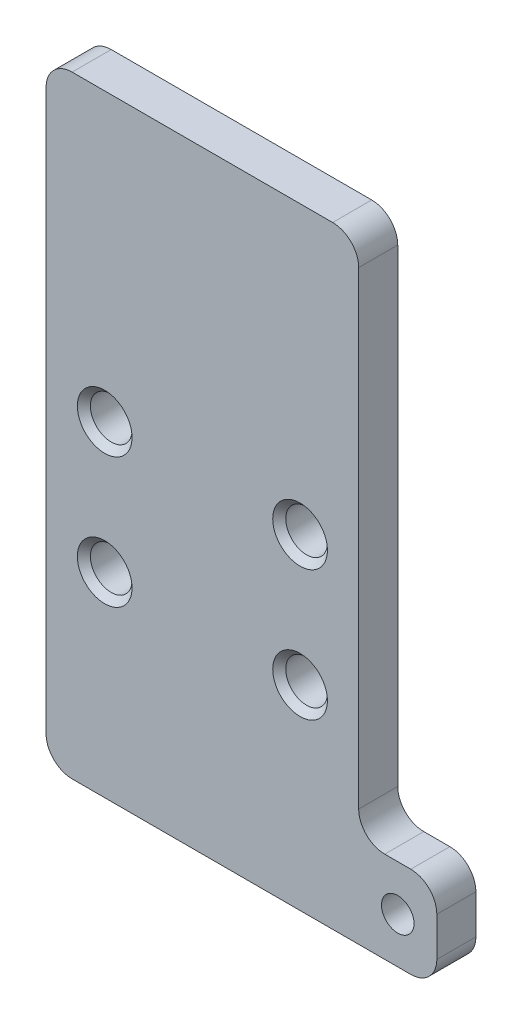
ISO-10303-21;
HEADER;
FILE_DESCRIPTION(('STEP AP214'),'2;1');
FILE_NAME('part.step','',(''),(''),'','','');
FILE_SCHEMA(('AUTOMOTIVE_DESIGN { 1 0 10303 214 1 1 1 1 }'));
ENDSEC;
DATA;
#1=APPLICATION_CONTEXT('core data for automotive mechanical design processes');
#2=APPLICATION_PROTOCOL_DEFINITION('international standard','automotive_design',2000,#1);
#3=PRODUCT_CONTEXT('',#1,'mechanical');
#4=PRODUCT('Part','Part','',(#3));
#5=PRODUCT_RELATED_PRODUCT_CATEGORY('part','',(#4));
#6=PRODUCT_DEFINITION_FORMATION('','',#4);
#7=PRODUCT_DEFINITION_CONTEXT('part definition',#1,'design');
#8=PRODUCT_DEFINITION('design','',#6,#7);
#9=PRODUCT_DEFINITION_SHAPE('','',#8);
#10=(LENGTH_UNIT() NAMED_UNIT(*) SI_UNIT(.MILLI.,.METRE.));
#11=(NAMED_UNIT(*) PLANE_ANGLE_UNIT() SI_UNIT($,.RADIAN.));
#12=(NAMED_UNIT(*) SI_UNIT($,.STERADIAN.) SOLID_ANGLE_UNIT());
#13=UNCERTAINTY_MEASURE_WITH_UNIT(LENGTH_MEASURE(1.E-05),#10,'distance_accuracy_value','');
#14=(GEOMETRIC_REPRESENTATION_CONTEXT(3) GLOBAL_UNCERTAINTY_ASSIGNED_CONTEXT((#13)) GLOBAL_UNIT_ASSIGNED_CONTEXT((#10,
#11,#12)) REPRESENTATION_CONTEXT('',''));
#15=CARTESIAN_POINT('',(0.,0.,0.));
#16=DIRECTION('',(0.,0.,1.));
#17=DIRECTION('',(1.,0.,0.));
#18=AXIS2_PLACEMENT_3D('',#15,#16,#17);
#19=CARTESIAN_POINT('',(0.,0.,3.));
#20=DIRECTION('',(0.,0.,-1.));
#21=DIRECTION('',(-1.,0.,0.));
#22=AXIS2_PLACEMENT_3D('',#19,#20,#21);
#23=PLANE('',#22);
#24=CARTESIAN_POINT('',(7.5,-17.,3.));
#25=DIRECTION('',(0.,0.,-1.));
#26=DIRECTION('',(-1.,0.,0.));
#27=AXIS2_PLACEMENT_3D('',#24,#25,#26);
#28=CIRCLE('',#27,2.1);
#29=CARTESIAN_POINT('',(5.4,-17.,3.));
#30=VERTEX_POINT('',#29);
#31=EDGE_CURVE('E202',#30,#30,#28,.T.);
#32=ORIENTED_EDGE('',*,*,#31,.T.);
#33=EDGE_LOOP('',(#32));
#34=FACE_BOUND('',#33,.T.);
#35=CARTESIAN_POINT('',(-7.5,-17.,3.));
#36=DIRECTION('',(0.,0.,-1.));
#37=DIRECTION('',(-1.,0.,0.));
#38=AXIS2_PLACEMENT_3D('',#35,#36,#37);
#39=CIRCLE('',#38,2.1);
#40=CARTESIAN_POINT('',(-9.6,-17.,3.));
#41=VERTEX_POINT('',#40);
#42=EDGE_CURVE('E199',#41,#41,#39,.T.);
#43=ORIENTED_EDGE('',*,*,#42,.T.);
#44=EDGE_LOOP('',(#43));
#45=FACE_BOUND('',#44,.T.);
#46=CARTESIAN_POINT('',(7.5,-7.,3.));
#47=DIRECTION('',(0.,0.,-1.));
#48=DIRECTION('',(-1.,0.,0.));
#49=AXIS2_PLACEMENT_3D('',#46,#47,#48);
#50=CIRCLE('',#49,2.1);
#51=CARTESIAN_POINT('',(5.4,-7.,3.));
#52=VERTEX_POINT('',#51);
#53=EDGE_CURVE('E195',#52,#52,#50,.T.);
#54=ORIENTED_EDGE('',*,*,#53,.T.);
#55=EDGE_LOOP('',(#54));
#56=FACE_BOUND('',#55,.T.);
#57=CARTESIAN_POINT('',(-7.5,-7.,3.));
#58=DIRECTION('',(0.,0.,-1.));
#59=DIRECTION('',(-1.,0.,0.));
#60=AXIS2_PLACEMENT_3D('',#57,#58,#59);
#61=CIRCLE('',#60,2.1);
#62=CARTESIAN_POINT('',(-9.6,-7.,3.));
#63=VERTEX_POINT('',#62);
#64=EDGE_CURVE('E191',#63,#63,#61,.T.);
#65=ORIENTED_EDGE('',*,*,#64,.T.);
#66=EDGE_LOOP('',(#65));
#67=FACE_BOUND('',#66,.T.);
#68=DIRECTION('',(0.,1.,0.));
#69=VECTOR('',#68,1.);
#70=CARTESIAN_POINT('',(12.,15.,3.));
#71=LINE('',#70,#69);
#72=CARTESIAN_POINT('',(12.,-23.,3.));
#73=VERTEX_POINT('',#72);
#74=CARTESIAN_POINT('',(12.,13.,3.));
#75=VERTEX_POINT('',#74);
#76=EDGE_CURVE('E291',#73,#75,#71,.T.);
#77=ORIENTED_EDGE('',*,*,#76,.T.);
#78=CARTESIAN_POINT('',(10.,13.,3.));
#79=DIRECTION('',(0.,0.,-1.));
#80=DIRECTION('',(-1.,0.,0.));
#81=AXIS2_PLACEMENT_3D('',#78,#79,#80);
#82=CIRCLE('',#81,2.);
#83=CARTESIAN_POINT('',(10.,15.,3.));
#84=VERTEX_POINT('',#83);
#85=EDGE_CURVE('E246',#75,#84,#82,.F.);
#86=ORIENTED_EDGE('',*,*,#85,.T.);
#87=DIRECTION('',(-1.,0.,0.));
#88=VECTOR('',#87,1.);
#89=CARTESIAN_POINT('',(-12.,15.,3.));
#90=LINE('',#89,#88);
#91=CARTESIAN_POINT('',(-10.,15.,3.));
#92=VERTEX_POINT('',#91);
#93=EDGE_CURVE('E156',#84,#92,#90,.T.);
#94=ORIENTED_EDGE('',*,*,#93,.T.);
#95=CARTESIAN_POINT('',(-10.,13.,3.));
#96=DIRECTION('',(0.,0.,-1.));
#97=DIRECTION('',(-1.,0.,0.));
#98=AXIS2_PLACEMENT_3D('',#95,#96,#97);
#99=CIRCLE('',#98,2.);
#100=CARTESIAN_POINT('',(-12.,13.,3.));
#101=VERTEX_POINT('',#100);
#102=EDGE_CURVE('E68',#92,#101,#99,.F.);
#103=ORIENTED_EDGE('',*,*,#102,.T.);
#104=DIRECTION('',(0.,-1.,0.));
#105=VECTOR('',#104,1.);
#106=CARTESIAN_POINT('',(-12.,15.,3.));
#107=LINE('',#106,#105);
#108=CARTESIAN_POINT('',(-12.,-30.,3.));
#109=VERTEX_POINT('',#108);
#110=EDGE_CURVE('E183',#101,#109,#107,.T.);
#111=ORIENTED_EDGE('',*,*,#110,.T.);
#112=CARTESIAN_POINT('',(-10.,-30.,3.));
#113=DIRECTION('',(0.,0.,-1.));
#114=DIRECTION('',(-1.,0.,0.));
#115=AXIS2_PLACEMENT_3D('',#112,#113,#114);
#116=CIRCLE('',#115,2.);
#117=CARTESIAN_POINT('',(-10.,-32.,3.));
#118=VERTEX_POINT('',#117);
#119=EDGE_CURVE('E241',#109,#118,#116,.F.);
#120=ORIENTED_EDGE('',*,*,#119,.T.);
#121=DIRECTION('',(1.,0.,0.));
#122=VECTOR('',#121,1.);
#123=CARTESIAN_POINT('',(-12.,-32.,3.));
#124=LINE('',#123,#122);
#125=CARTESIAN_POINT('',(16.,-32.,3.));
#126=VERTEX_POINT('',#125);
#127=EDGE_CURVE('E171',#118,#126,#124,.T.);
#128=ORIENTED_EDGE('',*,*,#127,.T.);
#129=CARTESIAN_POINT('',(16.,-30.,3.));
#130=DIRECTION('',(0.,0.,-1.));
#131=DIRECTION('',(-1.,0.,0.));
#132=AXIS2_PLACEMENT_3D('',#129,#130,#131);
#133=CIRCLE('',#132,2.);
#134=CARTESIAN_POINT('',(18.,-30.,3.));
#135=VERTEX_POINT('',#134);
#136=EDGE_CURVE('E238',#126,#135,#133,.F.);
#137=ORIENTED_EDGE('',*,*,#136,.T.);
#138=DIRECTION('',(0.,1.,0.));
#139=VECTOR('',#138,1.);
#140=CARTESIAN_POINT('',(18.,-25.,3.));
#141=LINE('',#140,#139);
#142=CARTESIAN_POINT('',(18.,-27.,3.));
#143=VERTEX_POINT('',#142);
#144=EDGE_CURVE('E300',#135,#143,#141,.T.);
#145=ORIENTED_EDGE('',*,*,#144,.T.);
#146=CARTESIAN_POINT('',(16.,-27.,3.));
#147=DIRECTION('',(0.,0.,-1.));
#148=DIRECTION('',(-1.,0.,0.));
#149=AXIS2_PLACEMENT_3D('',#146,#147,#148);
#150=CIRCLE('',#149,2.);
#151=CARTESIAN_POINT('',(16.,-25.,3.));
#152=VERTEX_POINT('',#151);
#153=EDGE_CURVE('E235',#143,#152,#150,.F.);
#154=ORIENTED_EDGE('',*,*,#153,.T.);
#155=DIRECTION('',(-1.,0.,0.));
#156=VECTOR('',#155,1.);
#157=CARTESIAN_POINT('',(12.,-25.,3.));
#158=LINE('',#157,#156);
#159=CARTESIAN_POINT('',(14.,-25.,3.));
#160=VERTEX_POINT('',#159);
#161=EDGE_CURVE('E292',#152,#160,#158,.T.);
#162=ORIENTED_EDGE('',*,*,#161,.T.);
#163=CARTESIAN_POINT('',(14.,-23.,3.));
#164=DIRECTION('',(0.,0.,-1.));
#165=DIRECTION('',(-1.,0.,0.));
#166=AXIS2_PLACEMENT_3D('',#163,#164,#165);
#167=CIRCLE('',#166,2.);
#168=EDGE_CURVE('E11',#160,#73,#167,.T.);
#169=ORIENTED_EDGE('',*,*,#168,.T.);
#170=EDGE_LOOP('',(#77,#86,#94,#103,#111,#120,#128,#137,#145,#154,#162,#169));
#171=FACE_BOUND('',#170,.T.);
#172=CARTESIAN_POINT('',(15.,-28.5,3.));
#173=DIRECTION('',(0.,0.,1.));
#174=DIRECTION('',(1.,0.,0.));
#175=AXIS2_PLACEMENT_3D('',#172,#173,#174);
#176=CIRCLE('',#175,1.25);
#177=CARTESIAN_POINT('',(16.25,-28.5,3.));
#178=VERTEX_POINT('',#177);
#179=EDGE_CURVE('E310',#178,#178,#176,.T.);
#180=ORIENTED_EDGE('',*,*,#179,.F.);
#181=EDGE_LOOP('',(#180));
#182=FACE_BOUND('',#181,.T.);
#183=ADVANCED_FACE('F45',(#34,#45,#56,#67,#171,#182),#23,.F.);
#184=CARTESIAN_POINT('',(0.,0.,0.));
#185=DIRECTION('',(0.,0.,-1.));
#186=DIRECTION('',(-1.,0.,0.));
#187=AXIS2_PLACEMENT_3D('',#184,#185,#186);
#188=PLANE('',#187);
#189=CARTESIAN_POINT('',(15.,-28.5,0.));
#190=DIRECTION('',(0.,0.,-1.));
#191=DIRECTION('',(-1.,0.,0.));
#192=AXIS2_PLACEMENT_3D('',#189,#190,#191);
#193=CIRCLE('',#192,1.74999999999999);
#194=CARTESIAN_POINT('',(13.25,-28.5,0.));
#195=VERTEX_POINT('',#194);
#196=EDGE_CURVE('E178',#195,#195,#193,.F.);
#197=ORIENTED_EDGE('',*,*,#196,.T.);
#198=EDGE_LOOP('',(#197));
#199=FACE_BOUND('',#198,.T.);
#200=CARTESIAN_POINT('',(-7.5,-17.,0.));
#201=DIRECTION('',(0.,0.,1.));
#202=DIRECTION('',(1.,0.,0.));
#203=AXIS2_PLACEMENT_3D('',#200,#201,#202);
#204=CIRCLE('',#203,1.6);
#205=CARTESIAN_POINT('',(-5.9,-17.,0.));
#206=VERTEX_POINT('',#205);
#207=EDGE_CURVE('E340',#206,#206,#204,.T.);
#208=ORIENTED_EDGE('',*,*,#207,.T.);
#209=EDGE_LOOP('',(#208));
#210=FACE_BOUND('',#209,.T.);
#211=CARTESIAN_POINT('',(-7.5,-7.,0.));
#212=DIRECTION('',(0.,0.,1.));
#213=DIRECTION('',(1.,0.,0.));
#214=AXIS2_PLACEMENT_3D('',#211,#212,#213);
#215=CIRCLE('',#214,1.6);
#216=CARTESIAN_POINT('',(-5.9,-7.,0.));
#217=VERTEX_POINT('',#216);
#218=EDGE_CURVE('E332',#217,#217,#215,.T.);
#219=ORIENTED_EDGE('',*,*,#218,.T.);
#220=EDGE_LOOP('',(#219));
#221=FACE_BOUND('',#220,.T.);
#222=DIRECTION('',(-1.,0.,0.));
#223=VECTOR('',#222,1.);
#224=CARTESIAN_POINT('',(-12.,15.,0.));
#225=LINE('',#224,#223);
#226=CARTESIAN_POINT('',(10.,15.,0.));
#227=VERTEX_POINT('',#226);
#228=CARTESIAN_POINT('',(-10.,15.,0.));
#229=VERTEX_POINT('',#228);
#230=EDGE_CURVE('E154',#227,#229,#225,.T.);
#231=ORIENTED_EDGE('',*,*,#230,.F.);
#232=CARTESIAN_POINT('',(10.,13.,0.));
#233=DIRECTION('',(0.,0.,-1.));
#234=DIRECTION('',(-1.,0.,0.));
#235=AXIS2_PLACEMENT_3D('',#232,#233,#234);
#236=CIRCLE('',#235,2.);
#237=CARTESIAN_POINT('',(12.,13.,0.));
#238=VERTEX_POINT('',#237);
#239=EDGE_CURVE('E136',#227,#238,#236,.T.);
#240=ORIENTED_EDGE('',*,*,#239,.T.);
#241=DIRECTION('',(0.,1.,0.));
#242=VECTOR('',#241,1.);
#243=CARTESIAN_POINT('',(12.,15.,0.));
#244=LINE('',#243,#242);
#245=CARTESIAN_POINT('',(12.,-23.,0.));
#246=VERTEX_POINT('',#245);
#247=EDGE_CURVE('E166',#246,#238,#244,.T.);
#248=ORIENTED_EDGE('',*,*,#247,.F.);
#249=CARTESIAN_POINT('',(14.,-23.,0.));
#250=DIRECTION('',(0.,0.,-1.));
#251=DIRECTION('',(-1.,0.,0.));
#252=AXIS2_PLACEMENT_3D('',#249,#250,#251);
#253=CIRCLE('',#252,2.);
#254=CARTESIAN_POINT('',(14.,-25.,0.));
#255=VERTEX_POINT('',#254);
#256=EDGE_CURVE('E54',#246,#255,#253,.F.);
#257=ORIENTED_EDGE('',*,*,#256,.T.);
#258=DIRECTION('',(-1.,0.,0.));
#259=VECTOR('',#258,1.);
#260=CARTESIAN_POINT('',(12.,-25.,0.));
#261=LINE('',#260,#259);
#262=CARTESIAN_POINT('',(16.,-25.,0.));
#263=VERTEX_POINT('',#262);
#264=EDGE_CURVE('E174',#263,#255,#261,.T.);
#265=ORIENTED_EDGE('',*,*,#264,.F.);
#266=CARTESIAN_POINT('',(16.,-27.,0.));
#267=DIRECTION('',(0.,0.,-1.));
#268=DIRECTION('',(-1.,0.,0.));
#269=AXIS2_PLACEMENT_3D('',#266,#267,#268);
#270=CIRCLE('',#269,2.);
#271=CARTESIAN_POINT('',(18.,-27.,0.));
#272=VERTEX_POINT('',#271);
#273=EDGE_CURVE('E158',#263,#272,#270,.T.);
#274=ORIENTED_EDGE('',*,*,#273,.T.);
#275=DIRECTION('',(0.,1.,0.));
#276=VECTOR('',#275,1.);
#277=CARTESIAN_POINT('',(18.,-25.,0.));
#278=LINE('',#277,#276);
#279=CARTESIAN_POINT('',(18.,-30.,0.));
#280=VERTEX_POINT('',#279);
#281=EDGE_CURVE('E286',#280,#272,#278,.T.);
#282=ORIENTED_EDGE('',*,*,#281,.F.);
#283=CARTESIAN_POINT('',(16.,-30.,0.));
#284=DIRECTION('',(0.,0.,-1.));
#285=DIRECTION('',(-1.,0.,0.));
#286=AXIS2_PLACEMENT_3D('',#283,#284,#285);
#287=CIRCLE('',#286,2.);
#288=CARTESIAN_POINT('',(16.,-32.,0.));
#289=VERTEX_POINT('',#288);
#290=EDGE_CURVE('E222',#280,#289,#287,.T.);
#291=ORIENTED_EDGE('',*,*,#290,.T.);
#292=DIRECTION('',(1.,0.,0.));
#293=VECTOR('',#292,1.);
#294=CARTESIAN_POINT('',(-12.,-32.,0.));
#295=LINE('',#294,#293);
#296=CARTESIAN_POINT('',(-10.,-32.,0.));
#297=VERTEX_POINT('',#296);
#298=EDGE_CURVE('E306',#297,#289,#295,.T.);
#299=ORIENTED_EDGE('',*,*,#298,.F.);
#300=CARTESIAN_POINT('',(-10.,-30.,0.));
#301=DIRECTION('',(0.,0.,-1.));
#302=DIRECTION('',(-1.,0.,0.));
#303=AXIS2_PLACEMENT_3D('',#300,#301,#302);
#304=CIRCLE('',#303,2.);
#305=CARTESIAN_POINT('',(-12.,-30.,0.));
#306=VERTEX_POINT('',#305);
#307=EDGE_CURVE('E225',#297,#306,#304,.T.);
#308=ORIENTED_EDGE('',*,*,#307,.T.);
#309=DIRECTION('',(0.,-1.,0.));
#310=VECTOR('',#309,1.);
#311=CARTESIAN_POINT('',(-12.,15.,0.));
#312=LINE('',#311,#310);
#313=CARTESIAN_POINT('',(-12.,13.,0.));
#314=VERTEX_POINT('',#313);
#315=EDGE_CURVE('E165',#314,#306,#312,.T.);
#316=ORIENTED_EDGE('',*,*,#315,.F.);
#317=CARTESIAN_POINT('',(-10.,13.,0.));
#318=DIRECTION('',(0.,0.,-1.));
#319=DIRECTION('',(-1.,0.,0.));
#320=AXIS2_PLACEMENT_3D('',#317,#318,#319);
#321=CIRCLE('',#320,2.);
#322=EDGE_CURVE('E148',#314,#229,#321,.T.);
#323=ORIENTED_EDGE('',*,*,#322,.T.);
#324=EDGE_LOOP('',(#231,#240,#248,#257,#265,#274,#282,#291,#299,#308,#316,#323));
#325=FACE_BOUND('',#324,.T.);
#326=CARTESIAN_POINT('',(7.5,-7.,0.));
#327=DIRECTION('',(0.,0.,1.));
#328=DIRECTION('',(1.,0.,0.));
#329=AXIS2_PLACEMENT_3D('',#326,#327,#328);
#330=CIRCLE('',#329,1.6);
#331=CARTESIAN_POINT('',(9.1,-7.,0.));
#332=VERTEX_POINT('',#331);
#333=EDGE_CURVE('E336',#332,#332,#330,.T.);
#334=ORIENTED_EDGE('',*,*,#333,.T.);
#335=EDGE_LOOP('',(#334));
#336=FACE_BOUND('',#335,.T.);
#337=CARTESIAN_POINT('',(7.5,-17.,0.));
#338=DIRECTION('',(0.,0.,1.));
#339=DIRECTION('',(1.,0.,0.));
#340=AXIS2_PLACEMENT_3D('',#337,#338,#339);
#341=CIRCLE('',#340,1.6);
#342=CARTESIAN_POINT('',(9.1,-17.,0.));
#343=VERTEX_POINT('',#342);
#344=EDGE_CURVE('E344',#343,#343,#341,.T.);
#345=ORIENTED_EDGE('',*,*,#344,.T.);
#346=EDGE_LOOP('',(#345));
#347=FACE_BOUND('',#346,.T.);
#348=ADVANCED_FACE('F161',(#199,#210,#221,#325,#336,#347),#188,.T.);
#349=CARTESIAN_POINT('',(-12.,-32.,3.));
#350=DIRECTION('',(0.,1.,0.));
#351=DIRECTION('',(0.,0.,1.));
#352=AXIS2_PLACEMENT_3D('',#349,#350,#351);
#353=PLANE('',#352);
#354=ORIENTED_EDGE('',*,*,#127,.F.);
#355=DIRECTION('',(0.,0.,-1.));
#356=VECTOR('',#355,1.);
#357=CARTESIAN_POINT('',(-10.,-32.,3.));
#358=LINE('',#357,#356);
#359=EDGE_CURVE('E258',#118,#297,#358,.T.);
#360=ORIENTED_EDGE('',*,*,#359,.T.);
#361=ORIENTED_EDGE('',*,*,#298,.T.);
#362=DIRECTION('',(0.,0.,-1.));
#363=VECTOR('',#362,1.);
#364=CARTESIAN_POINT('',(16.,-32.,3.));
#365=LINE('',#364,#363);
#366=EDGE_CURVE('E255',#289,#126,#365,.F.);
#367=ORIENTED_EDGE('',*,*,#366,.T.);
#368=EDGE_LOOP('',(#354,#360,#361,#367));
#369=FACE_BOUND('',#368,.T.);
#370=ADVANCED_FACE('F370',(#369),#353,.F.);
#371=CARTESIAN_POINT('',(18.,-25.,3.));
#372=DIRECTION('',(-1.,0.,0.));
#373=DIRECTION('',(0.,0.,1.));
#374=AXIS2_PLACEMENT_3D('',#371,#372,#373);
#375=PLANE('',#374);
#376=ORIENTED_EDGE('',*,*,#144,.F.);
#377=DIRECTION('',(0.,0.,-1.));
#378=VECTOR('',#377,1.);
#379=CARTESIAN_POINT('',(18.,-30.,3.));
#380=LINE('',#379,#378);
#381=EDGE_CURVE('E264',#135,#280,#380,.T.);
#382=ORIENTED_EDGE('',*,*,#381,.T.);
#383=ORIENTED_EDGE('',*,*,#281,.T.);
#384=DIRECTION('',(0.,0.,-1.));
#385=VECTOR('',#384,1.);
#386=CARTESIAN_POINT('',(18.,-27.,3.));
#387=LINE('',#386,#385);
#388=EDGE_CURVE('E262',#272,#143,#387,.F.);
#389=ORIENTED_EDGE('',*,*,#388,.T.);
#390=EDGE_LOOP('',(#376,#382,#383,#389));
#391=FACE_BOUND('',#390,.T.);
#392=ADVANCED_FACE('F317',(#391),#375,.F.);
#393=CARTESIAN_POINT('',(12.,-25.,3.));
#394=DIRECTION('',(0.,-1.,0.));
#395=DIRECTION('',(0.,0.,-1.));
#396=AXIS2_PLACEMENT_3D('',#393,#394,#395);
#397=PLANE('',#396);
#398=ORIENTED_EDGE('',*,*,#161,.F.);
#399=DIRECTION('',(0.,0.,-1.));
#400=VECTOR('',#399,1.);
#401=CARTESIAN_POINT('',(16.,-25.,3.));
#402=LINE('',#401,#400);
#403=EDGE_CURVE('E271',#152,#263,#402,.T.);
#404=ORIENTED_EDGE('',*,*,#403,.T.);
#405=ORIENTED_EDGE('',*,*,#264,.T.);
#406=DIRECTION('',(0.,0.,-1.));
#407=VECTOR('',#406,1.);
#408=CARTESIAN_POINT('',(14.,-25.,3.));
#409=LINE('',#408,#407);
#410=EDGE_CURVE('E268',#255,#160,#409,.F.);
#411=ORIENTED_EDGE('',*,*,#410,.T.);
#412=EDGE_LOOP('',(#398,#404,#405,#411));
#413=FACE_BOUND('',#412,.T.);
#414=ADVANCED_FACE('F282',(#413),#397,.F.);
#415=CARTESIAN_POINT('',(12.,15.,3.));
#416=DIRECTION('',(-1.,0.,0.));
#417=DIRECTION('',(0.,-1.,0.));
#418=AXIS2_PLACEMENT_3D('',#415,#416,#417);
#419=PLANE('',#418);
#420=ORIENTED_EDGE('',*,*,#247,.T.);
#421=DIRECTION('',(0.,0.,-1.));
#422=VECTOR('',#421,1.);
#423=CARTESIAN_POINT('',(12.,13.,3.));
#424=LINE('',#423,#422);
#425=EDGE_CURVE('E141',#238,#75,#424,.F.);
#426=ORIENTED_EDGE('',*,*,#425,.T.);
#427=ORIENTED_EDGE('',*,*,#76,.F.);
#428=DIRECTION('',(0.,0.,-1.));
#429=VECTOR('',#428,1.);
#430=CARTESIAN_POINT('',(12.,-23.,0.));
#431=LINE('',#430,#429);
#432=EDGE_CURVE('E147',#73,#246,#431,.T.);
#433=ORIENTED_EDGE('',*,*,#432,.T.);
#434=EDGE_LOOP('',(#420,#426,#427,#433));
#435=FACE_BOUND('',#434,.T.);
#436=ADVANCED_FACE('F294',(#435),#419,.F.);
#437=CARTESIAN_POINT('',(-12.,15.,3.));
#438=DIRECTION('',(0.,-1.,0.));
#439=DIRECTION('',(0.,0.,-1.));
#440=AXIS2_PLACEMENT_3D('',#437,#438,#439);
#441=PLANE('',#440);
#442=ORIENTED_EDGE('',*,*,#93,.F.);
#443=DIRECTION('',(0.,0.,-1.));
#444=VECTOR('',#443,1.);
#445=CARTESIAN_POINT('',(10.,15.,3.));
#446=LINE('',#445,#444);
#447=EDGE_CURVE('E140',#84,#227,#446,.T.);
#448=ORIENTED_EDGE('',*,*,#447,.T.);
#449=ORIENTED_EDGE('',*,*,#230,.T.);
#450=DIRECTION('',(0.,0.,-1.));
#451=VECTOR('',#450,1.);
#452=CARTESIAN_POINT('',(-10.,15.,3.));
#453=LINE('',#452,#451);
#454=EDGE_CURVE('E159',#229,#92,#453,.F.);
#455=ORIENTED_EDGE('',*,*,#454,.T.);
#456=EDGE_LOOP('',(#442,#448,#449,#455));
#457=FACE_BOUND('',#456,.T.);
#458=ADVANCED_FACE('F153',(#457),#441,.F.);
#459=CARTESIAN_POINT('',(-12.,15.,3.));
#460=DIRECTION('',(1.,0.,0.));
#461=DIRECTION('',(0.,1.,0.));
#462=AXIS2_PLACEMENT_3D('',#459,#460,#461);
#463=PLANE('',#462);
#464=ORIENTED_EDGE('',*,*,#110,.F.);
#465=DIRECTION('',(0.,0.,-1.));
#466=VECTOR('',#465,1.);
#467=CARTESIAN_POINT('',(-12.,13.,3.));
#468=LINE('',#467,#466);
#469=EDGE_CURVE('E251',#101,#314,#468,.T.);
#470=ORIENTED_EDGE('',*,*,#469,.T.);
#471=ORIENTED_EDGE('',*,*,#315,.T.);
#472=DIRECTION('',(0.,0.,-1.));
#473=VECTOR('',#472,1.);
#474=CARTESIAN_POINT('',(-12.,-30.,3.));
#475=LINE('',#474,#473);
#476=EDGE_CURVE('E61',#306,#109,#475,.F.);
#477=ORIENTED_EDGE('',*,*,#476,.T.);
#478=EDGE_LOOP('',(#464,#470,#471,#477));
#479=FACE_BOUND('',#478,.T.);
#480=ADVANCED_FACE('F378',(#479),#463,.F.);
#481=CARTESIAN_POINT('',(15.,-28.5,3.));
#482=DIRECTION('',(0.,0.,-1.));
#483=DIRECTION('',(-1.,0.,0.));
#484=AXIS2_PLACEMENT_3D('',#481,#482,#483);
#485=CYLINDRICAL_SURFACE('',#484,1.25);
#486=CARTESIAN_POINT('',(15.,-28.5,0.499999999999993));
#487=DIRECTION('',(0.,0.,-1.));
#488=DIRECTION('',(-1.,0.,0.));
#489=AXIS2_PLACEMENT_3D('',#486,#487,#488);
#490=CIRCLE('',#489,1.25);
#491=CARTESIAN_POINT('',(13.75,-28.5,0.499999999999993));
#492=VERTEX_POINT('',#491);
#493=EDGE_CURVE('E182',#492,#492,#490,.T.);
#494=ORIENTED_EDGE('',*,*,#493,.T.);
#495=EDGE_LOOP('',(#494));
#496=FACE_BOUND('',#495,.T.);
#497=ORIENTED_EDGE('',*,*,#179,.T.);
#498=EDGE_LOOP('',(#497));
#499=FACE_BOUND('',#498,.T.);
#500=ADVANCED_FACE('F375',(#496,#499),#485,.F.);
#501=CARTESIAN_POINT('',(-7.5,-7.,3.));
#502=DIRECTION('',(0.,0.,-1.));
#503=DIRECTION('',(-1.,0.,0.));
#504=AXIS2_PLACEMENT_3D('',#501,#502,#503);
#505=CYLINDRICAL_SURFACE('',#504,1.6);
#506=CARTESIAN_POINT('',(-7.5,-7.,2.49999999999999));
#507=DIRECTION('',(0.,0.,-1.));
#508=DIRECTION('',(-1.,0.,0.));
#509=AXIS2_PLACEMENT_3D('',#506,#507,#508);
#510=CIRCLE('',#509,1.6);
#511=CARTESIAN_POINT('',(-9.1,-7.,2.49999999999999));
#512=VERTEX_POINT('',#511);
#513=EDGE_CURVE('E214',#512,#512,#510,.F.);
#514=ORIENTED_EDGE('',*,*,#513,.T.);
#515=EDGE_LOOP('',(#514));
#516=FACE_BOUND('',#515,.T.);
#517=ORIENTED_EDGE('',*,*,#218,.F.);
#518=EDGE_LOOP('',(#517));
#519=FACE_BOUND('',#518,.T.);
#520=ADVANCED_FACE('F568',(#516,#519),#505,.F.);
#521=CARTESIAN_POINT('',(7.5,-7.,3.));
#522=DIRECTION('',(0.,0.,-1.));
#523=DIRECTION('',(-1.,0.,0.));
#524=AXIS2_PLACEMENT_3D('',#521,#522,#523);
#525=CYLINDRICAL_SURFACE('',#524,1.6);
#526=CARTESIAN_POINT('',(7.5,-7.,2.49999999999999));
#527=DIRECTION('',(0.,0.,-1.));
#528=DIRECTION('',(-1.,0.,0.));
#529=AXIS2_PLACEMENT_3D('',#526,#527,#528);
#530=CIRCLE('',#529,1.6);
#531=CARTESIAN_POINT('',(5.9,-7.,2.49999999999999));
#532=VERTEX_POINT('',#531);
#533=EDGE_CURVE('E210',#532,#532,#530,.F.);
#534=ORIENTED_EDGE('',*,*,#533,.T.);
#535=EDGE_LOOP('',(#534));
#536=FACE_BOUND('',#535,.T.);
#537=ORIENTED_EDGE('',*,*,#333,.F.);
#538=EDGE_LOOP('',(#537));
#539=FACE_BOUND('',#538,.T.);
#540=ADVANCED_FACE('F362',(#536,#539),#525,.F.);
#541=CARTESIAN_POINT('',(-7.5,-17.,3.));
#542=DIRECTION('',(0.,0.,-1.));
#543=DIRECTION('',(-1.,0.,0.));
#544=AXIS2_PLACEMENT_3D('',#541,#542,#543);
#545=CYLINDRICAL_SURFACE('',#544,1.6);
#546=CARTESIAN_POINT('',(-7.5,-17.,2.49999999999999));
#547=DIRECTION('',(0.,0.,-1.));
#548=DIRECTION('',(-1.,0.,0.));
#549=AXIS2_PLACEMENT_3D('',#546,#547,#548);
#550=CIRCLE('',#549,1.6);
#551=CARTESIAN_POINT('',(-9.1,-17.,2.49999999999999));
#552=VERTEX_POINT('',#551);
#553=EDGE_CURVE('E206',#552,#552,#550,.F.);
#554=ORIENTED_EDGE('',*,*,#553,.T.);
#555=EDGE_LOOP('',(#554));
#556=FACE_BOUND('',#555,.T.);
#557=ORIENTED_EDGE('',*,*,#207,.F.);
#558=EDGE_LOOP('',(#557));
#559=FACE_BOUND('',#558,.T.);
#560=ADVANCED_FACE('F353',(#556,#559),#545,.F.);
#561=CARTESIAN_POINT('',(7.5,-17.,3.));
#562=DIRECTION('',(0.,0.,-1.));
#563=DIRECTION('',(-1.,0.,0.));
#564=AXIS2_PLACEMENT_3D('',#561,#562,#563);
#565=CYLINDRICAL_SURFACE('',#564,1.6);
#566=CARTESIAN_POINT('',(7.5,-17.,2.49999999999999));
#567=DIRECTION('',(0.,0.,-1.));
#568=DIRECTION('',(-1.,0.,0.));
#569=AXIS2_PLACEMENT_3D('',#566,#567,#568);
#570=CIRCLE('',#569,1.6);
#571=CARTESIAN_POINT('',(5.9,-17.,2.49999999999999));
#572=VERTEX_POINT('',#571);
#573=EDGE_CURVE('E187',#572,#572,#570,.F.);
#574=ORIENTED_EDGE('',*,*,#573,.T.);
#575=EDGE_LOOP('',(#574));
#576=FACE_BOUND('',#575,.T.);
#577=ORIENTED_EDGE('',*,*,#344,.F.);
#578=EDGE_LOOP('',(#577));
#579=FACE_BOUND('',#578,.T.);
#580=ADVANCED_FACE('F350',(#576,#579),#565,.F.);
#581=CARTESIAN_POINT('',(15.,-28.5,0.));
#582=DIRECTION('',(0.,0.,-1.));
#583=DIRECTION('',(-1.,0.,0.));
#584=AXIS2_PLACEMENT_3D('',#581,#582,#583);
#585=CONICAL_SURFACE('',#584,1.74999999999999,0.785398163397446);
#586=ORIENTED_EDGE('',*,*,#493,.F.);
#587=EDGE_LOOP('',(#586));
#588=FACE_BOUND('',#587,.T.);
#589=ORIENTED_EDGE('',*,*,#196,.F.);
#590=EDGE_LOOP('',(#589));
#591=FACE_BOUND('',#590,.T.);
#592=ADVANCED_FACE('F352',(#588,#591),#585,.F.);
#593=CARTESIAN_POINT('',(7.5,-17.,2.49999999999999));
#594=DIRECTION('',(0.,0.,1.));
#595=DIRECTION('',(1.,0.,0.));
#596=AXIS2_PLACEMENT_3D('',#593,#594,#595);
#597=CONICAL_SURFACE('',#596,1.6,0.785398163397443);
#598=ORIENTED_EDGE('',*,*,#31,.F.);
#599=EDGE_LOOP('',(#598));
#600=FACE_BOUND('',#599,.T.);
#601=ORIENTED_EDGE('',*,*,#573,.F.);
#602=EDGE_LOOP('',(#601));
#603=FACE_BOUND('',#602,.T.);
#604=ADVANCED_FACE('F359',(#600,#603),#597,.F.);
#605=CARTESIAN_POINT('',(-7.5,-17.,2.49999999999999));
#606=DIRECTION('',(0.,0.,1.));
#607=DIRECTION('',(1.,0.,0.));
#608=AXIS2_PLACEMENT_3D('',#605,#606,#607);
#609=CONICAL_SURFACE('',#608,1.6,0.785398163397442);
#610=ORIENTED_EDGE('',*,*,#42,.F.);
#611=EDGE_LOOP('',(#610));
#612=FACE_BOUND('',#611,.T.);
#613=ORIENTED_EDGE('',*,*,#553,.F.);
#614=EDGE_LOOP('',(#613));
#615=FACE_BOUND('',#614,.T.);
#616=ADVANCED_FACE('F401',(#612,#615),#609,.F.);
#617=CARTESIAN_POINT('',(7.5,-7.,2.49999999999999));
#618=DIRECTION('',(0.,0.,1.));
#619=DIRECTION('',(1.,0.,0.));
#620=AXIS2_PLACEMENT_3D('',#617,#618,#619);
#621=CONICAL_SURFACE('',#620,1.6,0.785398163397443);
#622=ORIENTED_EDGE('',*,*,#53,.F.);
#623=EDGE_LOOP('',(#622));
#624=FACE_BOUND('',#623,.T.);
#625=ORIENTED_EDGE('',*,*,#533,.F.);
#626=EDGE_LOOP('',(#625));
#627=FACE_BOUND('',#626,.T.);
#628=ADVANCED_FACE('F408',(#624,#627),#621,.F.);
#629=CARTESIAN_POINT('',(-7.5,-7.,2.49999999999999));
#630=DIRECTION('',(0.,0.,1.));
#631=DIRECTION('',(1.,0.,0.));
#632=AXIS2_PLACEMENT_3D('',#629,#630,#631);
#633=CONICAL_SURFACE('',#632,1.6,0.785398163397442);
#634=ORIENTED_EDGE('',*,*,#64,.F.);
#635=EDGE_LOOP('',(#634));
#636=FACE_BOUND('',#635,.T.);
#637=ORIENTED_EDGE('',*,*,#513,.F.);
#638=EDGE_LOOP('',(#637));
#639=FACE_BOUND('',#638,.T.);
#640=ADVANCED_FACE('F415',(#636,#639),#633,.F.);
#641=CARTESIAN_POINT('',(10.,13.,3.));
#642=DIRECTION('',(0.,0.,-1.));
#643=DIRECTION('',(-1.,0.,0.));
#644=AXIS2_PLACEMENT_3D('',#641,#642,#643);
#645=CYLINDRICAL_SURFACE('',#644,2.);
#646=ORIENTED_EDGE('',*,*,#85,.F.);
#647=ORIENTED_EDGE('',*,*,#425,.F.);
#648=ORIENTED_EDGE('',*,*,#239,.F.);
#649=ORIENTED_EDGE('',*,*,#447,.F.);
#650=EDGE_LOOP('',(#646,#647,#648,#649));
#651=FACE_BOUND('',#650,.T.);
#652=ADVANCED_FACE('F139',(#651),#645,.T.);
#653=CARTESIAN_POINT('',(-10.,13.,3.));
#654=DIRECTION('',(0.,0.,-1.));
#655=DIRECTION('',(-1.,0.,0.));
#656=AXIS2_PLACEMENT_3D('',#653,#654,#655);
#657=CYLINDRICAL_SURFACE('',#656,2.);
#658=ORIENTED_EDGE('',*,*,#102,.F.);
#659=ORIENTED_EDGE('',*,*,#454,.F.);
#660=ORIENTED_EDGE('',*,*,#322,.F.);
#661=ORIENTED_EDGE('',*,*,#469,.F.);
#662=EDGE_LOOP('',(#658,#659,#660,#661));
#663=FACE_BOUND('',#662,.T.);
#664=ADVANCED_FACE('F424',(#663),#657,.T.);
#665=CARTESIAN_POINT('',(-10.,-30.,3.));
#666=DIRECTION('',(0.,0.,-1.));
#667=DIRECTION('',(-1.,0.,0.));
#668=AXIS2_PLACEMENT_3D('',#665,#666,#667);
#669=CYLINDRICAL_SURFACE('',#668,2.);
#670=ORIENTED_EDGE('',*,*,#119,.F.);
#671=ORIENTED_EDGE('',*,*,#476,.F.);
#672=ORIENTED_EDGE('',*,*,#307,.F.);
#673=ORIENTED_EDGE('',*,*,#359,.F.);
#674=EDGE_LOOP('',(#670,#671,#672,#673));
#675=FACE_BOUND('',#674,.T.);
#676=ADVANCED_FACE('F427',(#675),#669,.T.);
#677=CARTESIAN_POINT('',(16.,-30.,3.));
#678=DIRECTION('',(0.,0.,-1.));
#679=DIRECTION('',(-1.,0.,0.));
#680=AXIS2_PLACEMENT_3D('',#677,#678,#679);
#681=CYLINDRICAL_SURFACE('',#680,2.);
#682=ORIENTED_EDGE('',*,*,#136,.F.);
#683=ORIENTED_EDGE('',*,*,#366,.F.);
#684=ORIENTED_EDGE('',*,*,#290,.F.);
#685=ORIENTED_EDGE('',*,*,#381,.F.);
#686=EDGE_LOOP('',(#682,#683,#684,#685));
#687=FACE_BOUND('',#686,.T.);
#688=ADVANCED_FACE('F431',(#687),#681,.T.);
#689=CARTESIAN_POINT('',(16.,-27.,3.));
#690=DIRECTION('',(0.,0.,-1.));
#691=DIRECTION('',(-1.,0.,0.));
#692=AXIS2_PLACEMENT_3D('',#689,#690,#691);
#693=CYLINDRICAL_SURFACE('',#692,2.);
#694=ORIENTED_EDGE('',*,*,#153,.F.);
#695=ORIENTED_EDGE('',*,*,#388,.F.);
#696=ORIENTED_EDGE('',*,*,#273,.F.);
#697=ORIENTED_EDGE('',*,*,#403,.F.);
#698=EDGE_LOOP('',(#694,#695,#696,#697));
#699=FACE_BOUND('',#698,.T.);
#700=ADVANCED_FACE('F322',(#699),#693,.T.);
#701=CARTESIAN_POINT('',(14.,-23.,3.));
#702=DIRECTION('',(0.,0.,1.));
#703=DIRECTION('',(1.,0.,0.));
#704=AXIS2_PLACEMENT_3D('',#701,#702,#703);
#705=CYLINDRICAL_SURFACE('',#704,2.);
#706=ORIENTED_EDGE('',*,*,#168,.F.);
#707=ORIENTED_EDGE('',*,*,#410,.F.);
#708=ORIENTED_EDGE('',*,*,#256,.F.);
#709=ORIENTED_EDGE('',*,*,#432,.F.);
#710=EDGE_LOOP('',(#706,#707,#708,#709));
#711=FACE_BOUND('',#710,.T.);
#712=ADVANCED_FACE('F47',(#711),#705,.F.);
#713=CLOSED_SHELL('',(#183,#348,#370,#392,#414,#436,#458,#480,#500,#520,#540,#560,#580,#592,
#604,#616,#628,#640,#652,#664,#676,#688,#700,#712));
#714=MANIFOLD_SOLID_BREP('B2',#713);
#715=ADVANCED_BREP_SHAPE_REPRESENTATION('',(#18,#714),#14);
#716=SHAPE_DEFINITION_REPRESENTATION(#9,#715);
ENDSEC;
END-ISO-10303-21;
